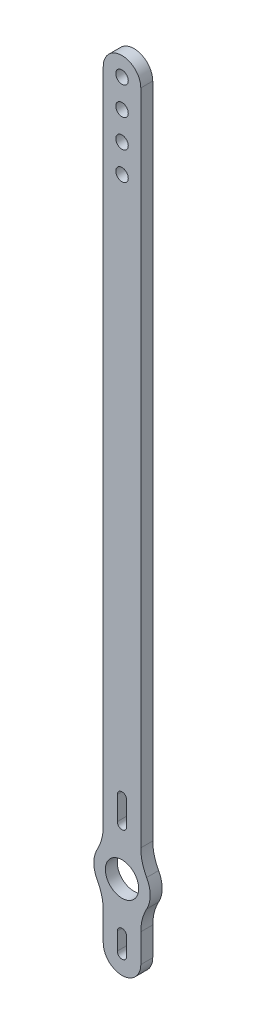
ISO-10303-21;
HEADER;
FILE_DESCRIPTION(('STEP AP214'),'2;1');
FILE_NAME('part.step','',(''),(''),'','','');
FILE_SCHEMA(('AUTOMOTIVE_DESIGN { 1 0 10303 214 1 1 1 1 }'));
ENDSEC;
DATA;
#1=APPLICATION_CONTEXT('core data for automotive mechanical design processes');
#2=APPLICATION_PROTOCOL_DEFINITION('international standard','automotive_design',2000,#1);
#3=PRODUCT_CONTEXT('',#1,'mechanical');
#4=PRODUCT('Part','Part','',(#3));
#5=PRODUCT_RELATED_PRODUCT_CATEGORY('part','',(#4));
#6=PRODUCT_DEFINITION_FORMATION('','',#4);
#7=PRODUCT_DEFINITION_CONTEXT('part definition',#1,'design');
#8=PRODUCT_DEFINITION('design','',#6,#7);
#9=PRODUCT_DEFINITION_SHAPE('','',#8);
#10=(LENGTH_UNIT() NAMED_UNIT(*) SI_UNIT(.MILLI.,.METRE.));
#11=(NAMED_UNIT(*) PLANE_ANGLE_UNIT() SI_UNIT($,.RADIAN.));
#12=(NAMED_UNIT(*) SI_UNIT($,.STERADIAN.) SOLID_ANGLE_UNIT());
#13=UNCERTAINTY_MEASURE_WITH_UNIT(LENGTH_MEASURE(1.E-05),#10,'distance_accuracy_value','');
#14=(GEOMETRIC_REPRESENTATION_CONTEXT(3) GLOBAL_UNCERTAINTY_ASSIGNED_CONTEXT((#13)) GLOBAL_UNIT_ASSIGNED_CONTEXT((#10,
#11,#12)) REPRESENTATION_CONTEXT('',''));
#15=CARTESIAN_POINT('',(0.,0.,0.));
#16=DIRECTION('',(0.,0.,1.));
#17=DIRECTION('',(1.,0.,0.));
#18=AXIS2_PLACEMENT_3D('',#15,#16,#17);
#19=CARTESIAN_POINT('',(0.,148.,2.55));
#20=DIRECTION('',(0.,0.,1.));
#21=DIRECTION('',(1.,0.,0.));
#22=AXIS2_PLACEMENT_3D('',#19,#20,#21);
#23=PLANE('',#22);
#24=CARTESIAN_POINT('',(0.,136.,2.55));
#25=DIRECTION('',(0.,0.,1.));
#26=DIRECTION('',(1.,0.,0.));
#27=AXIS2_PLACEMENT_3D('',#24,#25,#26);
#28=CIRCLE('',#27,1.32999999999999);
#29=CARTESIAN_POINT('',(1.32999999999997,136.,2.55));
#30=VERTEX_POINT('',#29);
#31=EDGE_CURVE('E640',#30,#30,#28,.T.);
#32=ORIENTED_EDGE('',*,*,#31,.F.);
#33=EDGE_LOOP('',(#32));
#34=FACE_BOUND('',#33,.T.);
#35=CARTESIAN_POINT('',(0.,148.,2.55));
#36=DIRECTION('',(0.,0.,1.));
#37=DIRECTION('',(1.,0.,0.));
#38=AXIS2_PLACEMENT_3D('',#35,#36,#37);
#39=CIRCLE('',#38,1.32999999999998);
#40=CARTESIAN_POINT('',(1.32999999999996,148.,2.55));
#41=VERTEX_POINT('',#40);
#42=EDGE_CURVE('E201',#41,#41,#39,.T.);
#43=ORIENTED_EDGE('',*,*,#42,.F.);
#44=EDGE_LOOP('',(#43));
#45=FACE_BOUND('',#44,.T.);
#46=DIRECTION('',(0.,-1.,0.));
#47=VECTOR('',#46,1.);
#48=CARTESIAN_POINT('',(-0.999999999999999,-10.1,2.55));
#49=LINE('',#48,#47);
#50=CARTESIAN_POINT('',(-0.999999999999999,-10.1,2.55));
#51=VERTEX_POINT('',#50);
#52=CARTESIAN_POINT('',(-0.999999999999998,-13.8,2.55));
#53=VERTEX_POINT('',#52);
#54=EDGE_CURVE('E213',#51,#53,#49,.T.);
#55=ORIENTED_EDGE('',*,*,#54,.F.);
#56=CARTESIAN_POINT('',(0.,-10.1,2.55));
#57=DIRECTION('',(0.,0.,1.));
#58=DIRECTION('',(1.,0.,0.));
#59=AXIS2_PLACEMENT_3D('',#56,#57,#58);
#60=CIRCLE('',#59,1.);
#61=CARTESIAN_POINT('',(1.,-10.1,2.55));
#62=VERTEX_POINT('',#61);
#63=EDGE_CURVE('E211',#62,#51,#60,.T.);
#64=ORIENTED_EDGE('',*,*,#63,.F.);
#65=DIRECTION('',(0.,1.,0.));
#66=VECTOR('',#65,1.);
#67=CARTESIAN_POINT('',(1.,-10.1,2.55));
#68=LINE('',#67,#66);
#69=CARTESIAN_POINT('',(1.,-13.8,2.55));
#70=VERTEX_POINT('',#69);
#71=EDGE_CURVE('E219',#70,#62,#68,.T.);
#72=ORIENTED_EDGE('',*,*,#71,.F.);
#73=CARTESIAN_POINT('',(0.,-13.8,2.55));
#74=DIRECTION('',(0.,0.,1.));
#75=DIRECTION('',(1.,0.,0.));
#76=AXIS2_PLACEMENT_3D('',#73,#74,#75);
#77=CIRCLE('',#76,1.);
#78=EDGE_CURVE('E216',#53,#70,#77,.T.);
#79=ORIENTED_EDGE('',*,*,#78,.F.);
#80=EDGE_LOOP('',(#55,#64,#72,#79));
#81=FACE_BOUND('',#80,.T.);
#82=CARTESIAN_POINT('',(0.,148.,2.55));
#83=DIRECTION('',(0.,0.,1.));
#84=DIRECTION('',(1.,0.,0.));
#85=AXIS2_PLACEMENT_3D('',#82,#83,#84);
#86=CIRCLE('',#85,4.);
#87=CARTESIAN_POINT('',(3.99999999999998,148.,2.55));
#88=VERTEX_POINT('',#87);
#89=CARTESIAN_POINT('',(-4.00000000000002,148.,2.55));
#90=VERTEX_POINT('',#89);
#91=EDGE_CURVE('E248',#88,#90,#86,.T.);
#92=ORIENTED_EDGE('',*,*,#91,.T.);
#93=DIRECTION('',(0.,-1.,0.));
#94=VECTOR('',#93,1.);
#95=CARTESIAN_POINT('',(-4.00000000000002,148.,2.55));
#96=LINE('',#95,#94);
#97=CARTESIAN_POINT('',(-4.,7.74596669241483,2.55));
#98=VERTEX_POINT('',#97);
#99=EDGE_CURVE('E251',#90,#98,#96,.T.);
#100=ORIENTED_EDGE('',*,*,#99,.T.);
#101=CARTESIAN_POINT('',(-14.,7.74596669241484,2.55));
#102=DIRECTION('',(0.,0.,-1.));
#103=DIRECTION('',(1.,0.,0.));
#104=AXIS2_PLACEMENT_3D('',#101,#102,#103);
#105=CIRCLE('',#104,10.);
#106=CARTESIAN_POINT('',(-5.25,2.90473750965556,2.55));
#107=VERTEX_POINT('',#106);
#108=EDGE_CURVE('E254',#98,#107,#105,.T.);
#109=ORIENTED_EDGE('',*,*,#108,.T.);
#110=CARTESIAN_POINT('',(0.,0.,2.55));
#111=DIRECTION('',(0.,0.,1.));
#112=DIRECTION('',(1.,0.,0.));
#113=AXIS2_PLACEMENT_3D('',#110,#111,#112);
#114=CIRCLE('',#113,6.);
#115=CARTESIAN_POINT('',(-5.25,-2.90473750965556,2.55));
#116=VERTEX_POINT('',#115);
#117=EDGE_CURVE('E256',#107,#116,#114,.T.);
#118=ORIENTED_EDGE('',*,*,#117,.T.);
#119=CARTESIAN_POINT('',(-14.,-7.74596669241484,2.55));
#120=DIRECTION('',(0.,0.,-1.));
#121=DIRECTION('',(-1.,0.,0.));
#122=AXIS2_PLACEMENT_3D('',#119,#120,#121);
#123=CIRCLE('',#122,10.);
#124=CARTESIAN_POINT('',(-4.,-7.74596669241483,2.55));
#125=VERTEX_POINT('',#124);
#126=EDGE_CURVE('E258',#116,#125,#123,.T.);
#127=ORIENTED_EDGE('',*,*,#126,.T.);
#128=DIRECTION('',(0.,-1.,0.));
#129=VECTOR('',#128,1.);
#130=CARTESIAN_POINT('',(-4.,-7.74596669241483,2.55));
#131=LINE('',#130,#129);
#132=CARTESIAN_POINT('',(-4.,-13.8,2.55));
#133=VERTEX_POINT('',#132);
#134=EDGE_CURVE('E260',#125,#133,#131,.T.);
#135=ORIENTED_EDGE('',*,*,#134,.T.);
#136=CARTESIAN_POINT('',(0.,-13.8,2.55));
#137=DIRECTION('',(0.,0.,1.));
#138=DIRECTION('',(1.,0.,0.));
#139=AXIS2_PLACEMENT_3D('',#136,#137,#138);
#140=CIRCLE('',#139,4.);
#141=CARTESIAN_POINT('',(4.,-13.8,2.55));
#142=VERTEX_POINT('',#141);
#143=EDGE_CURVE('E262',#133,#142,#140,.T.);
#144=ORIENTED_EDGE('',*,*,#143,.T.);
#145=DIRECTION('',(0.,1.,0.));
#146=VECTOR('',#145,1.);
#147=CARTESIAN_POINT('',(4.,-7.74596669241483,2.55));
#148=LINE('',#147,#146);
#149=CARTESIAN_POINT('',(4.,-7.74596669241483,2.55));
#150=VERTEX_POINT('',#149);
#151=EDGE_CURVE('E264',#142,#150,#148,.T.);
#152=ORIENTED_EDGE('',*,*,#151,.T.);
#153=CARTESIAN_POINT('',(14.,-7.74596669241483,2.55));
#154=DIRECTION('',(0.,0.,-1.));
#155=DIRECTION('',(1.,0.,0.));
#156=AXIS2_PLACEMENT_3D('',#153,#154,#155);
#157=CIRCLE('',#156,10.);
#158=CARTESIAN_POINT('',(5.25,-2.90473750965556,2.55));
#159=VERTEX_POINT('',#158);
#160=EDGE_CURVE('E266',#150,#159,#157,.T.);
#161=ORIENTED_EDGE('',*,*,#160,.T.);
#162=CARTESIAN_POINT('',(0.,0.,2.55));
#163=DIRECTION('',(0.,0.,1.));
#164=DIRECTION('',(1.,0.,0.));
#165=AXIS2_PLACEMENT_3D('',#162,#163,#164);
#166=CIRCLE('',#165,6.);
#167=CARTESIAN_POINT('',(5.25,2.90473750965556,2.55));
#168=VERTEX_POINT('',#167);
#169=EDGE_CURVE('E268',#159,#168,#166,.T.);
#170=ORIENTED_EDGE('',*,*,#169,.T.);
#171=CARTESIAN_POINT('',(14.,7.74596669241483,2.55));
#172=DIRECTION('',(0.,0.,-1.));
#173=DIRECTION('',(1.,0.,0.));
#174=AXIS2_PLACEMENT_3D('',#171,#172,#173);
#175=CIRCLE('',#174,10.);
#176=CARTESIAN_POINT('',(4.,7.74596669241483,2.55));
#177=VERTEX_POINT('',#176);
#178=EDGE_CURVE('E270',#168,#177,#175,.T.);
#179=ORIENTED_EDGE('',*,*,#178,.T.);
#180=DIRECTION('',(0.,1.,0.));
#181=VECTOR('',#180,1.);
#182=CARTESIAN_POINT('',(3.99999999999998,148.,2.55));
#183=LINE('',#182,#181);
#184=EDGE_CURVE('E272',#177,#88,#183,.T.);
#185=ORIENTED_EDGE('',*,*,#184,.T.);
#186=EDGE_LOOP('',(#92,#100,#109,#118,#127,#135,#144,#152,#161,#170,#179,#185));
#187=FACE_BOUND('',#186,.T.);
#188=CARTESIAN_POINT('',(0.,0.,2.55));
#189=DIRECTION('',(0.,0.,1.));
#190=DIRECTION('',(1.,0.,0.));
#191=AXIS2_PLACEMENT_3D('',#188,#189,#190);
#192=CIRCLE('',#191,3.55);
#193=CARTESIAN_POINT('',(3.55,0.,2.55));
#194=VERTEX_POINT('',#193);
#195=EDGE_CURVE('E242',#194,#194,#192,.T.);
#196=ORIENTED_EDGE('',*,*,#195,.F.);
#197=EDGE_LOOP('',(#196));
#198=FACE_BOUND('',#197,.T.);
#199=DIRECTION('',(0.,-1.,0.));
#200=VECTOR('',#199,1.);
#201=CARTESIAN_POINT('',(-1.,15.1,2.55));
#202=LINE('',#201,#200);
#203=CARTESIAN_POINT('',(-1.,15.1,2.55));
#204=VERTEX_POINT('',#203);
#205=CARTESIAN_POINT('',(-1.,10.1,2.55));
#206=VERTEX_POINT('',#205);
#207=EDGE_CURVE('E180',#204,#206,#202,.T.);
#208=ORIENTED_EDGE('',*,*,#207,.F.);
#209=CARTESIAN_POINT('',(0.,15.1,2.55));
#210=DIRECTION('',(0.,0.,1.));
#211=DIRECTION('',(1.,0.,0.));
#212=AXIS2_PLACEMENT_3D('',#209,#210,#211);
#213=CIRCLE('',#212,1.);
#214=CARTESIAN_POINT('',(0.999999999999998,15.1,2.55));
#215=VERTEX_POINT('',#214);
#216=EDGE_CURVE('E172',#215,#204,#213,.T.);
#217=ORIENTED_EDGE('',*,*,#216,.F.);
#218=DIRECTION('',(0.,1.,0.));
#219=VECTOR('',#218,1.);
#220=CARTESIAN_POINT('',(0.999999999999998,15.1,2.55));
#221=LINE('',#220,#219);
#222=CARTESIAN_POINT('',(0.999999999999999,10.1,2.55));
#223=VERTEX_POINT('',#222);
#224=EDGE_CURVE('E195',#223,#215,#221,.T.);
#225=ORIENTED_EDGE('',*,*,#224,.F.);
#226=CARTESIAN_POINT('',(0.,10.1,2.55));
#227=DIRECTION('',(0.,0.,1.));
#228=DIRECTION('',(1.,0.,0.));
#229=AXIS2_PLACEMENT_3D('',#226,#227,#228);
#230=CIRCLE('',#229,1.);
#231=EDGE_CURVE('E193',#206,#223,#230,.T.);
#232=ORIENTED_EDGE('',*,*,#231,.F.);
#233=EDGE_LOOP('',(#208,#217,#225,#232));
#234=FACE_BOUND('',#233,.T.);
#235=CARTESIAN_POINT('',(0.,142.,2.55));
#236=DIRECTION('',(0.,0.,1.));
#237=DIRECTION('',(1.,0.,0.));
#238=AXIS2_PLACEMENT_3D('',#235,#236,#237);
#239=CIRCLE('',#238,1.32999999999999);
#240=CARTESIAN_POINT('',(1.32999999999997,142.,2.55));
#241=VERTEX_POINT('',#240);
#242=EDGE_CURVE('E646',#241,#241,#239,.T.);
#243=ORIENTED_EDGE('',*,*,#242,.F.);
#244=EDGE_LOOP('',(#243));
#245=FACE_BOUND('',#244,.T.);
#246=CARTESIAN_POINT('',(0.,130.,2.55));
#247=DIRECTION('',(0.,0.,1.));
#248=DIRECTION('',(1.,0.,0.));
#249=AXIS2_PLACEMENT_3D('',#246,#247,#248);
#250=CIRCLE('',#249,1.33);
#251=CARTESIAN_POINT('',(1.32999999999998,130.,2.55));
#252=VERTEX_POINT('',#251);
#253=EDGE_CURVE('E631',#252,#252,#250,.T.);
#254=ORIENTED_EDGE('',*,*,#253,.F.);
#255=EDGE_LOOP('',(#254));
#256=FACE_BOUND('',#255,.T.);
#257=ADVANCED_FACE('F35',(#34,#45,#81,#187,#198,#234,#245,#256),#23,.T.);
#258=CARTESIAN_POINT('',(0.,148.,0.));
#259=DIRECTION('',(0.,0.,1.));
#260=DIRECTION('',(1.,0.,0.));
#261=AXIS2_PLACEMENT_3D('',#258,#259,#260);
#262=PLANE('',#261);
#263=CARTESIAN_POINT('',(0.,136.,0.));
#264=DIRECTION('',(0.,0.,1.));
#265=DIRECTION('',(1.,0.,0.));
#266=AXIS2_PLACEMENT_3D('',#263,#264,#265);
#267=CIRCLE('',#266,1.32999999999999);
#268=CARTESIAN_POINT('',(1.32999999999997,136.,0.));
#269=VERTEX_POINT('',#268);
#270=EDGE_CURVE('E637',#269,#269,#267,.T.);
#271=ORIENTED_EDGE('',*,*,#270,.T.);
#272=EDGE_LOOP('',(#271));
#273=FACE_BOUND('',#272,.T.);
#274=CARTESIAN_POINT('',(0.,148.,0.));
#275=DIRECTION('',(0.,0.,1.));
#276=DIRECTION('',(1.,0.,0.));
#277=AXIS2_PLACEMENT_3D('',#274,#275,#276);
#278=CIRCLE('',#277,1.32999999999998);
#279=CARTESIAN_POINT('',(1.32999999999996,148.,0.));
#280=VERTEX_POINT('',#279);
#281=EDGE_CURVE('E649',#280,#280,#278,.T.);
#282=ORIENTED_EDGE('',*,*,#281,.T.);
#283=EDGE_LOOP('',(#282));
#284=FACE_BOUND('',#283,.T.);
#285=CARTESIAN_POINT('',(0.,-10.1,0.));
#286=DIRECTION('',(0.,0.,1.));
#287=DIRECTION('',(1.,0.,0.));
#288=AXIS2_PLACEMENT_3D('',#285,#286,#287);
#289=CIRCLE('',#288,1.);
#290=CARTESIAN_POINT('',(1.,-10.1,0.));
#291=VERTEX_POINT('',#290);
#292=CARTESIAN_POINT('',(-0.999999999999999,-10.1,0.));
#293=VERTEX_POINT('',#292);
#294=EDGE_CURVE('E188',#291,#293,#289,.T.);
#295=ORIENTED_EDGE('',*,*,#294,.T.);
#296=DIRECTION('',(0.,-1.,0.));
#297=VECTOR('',#296,1.);
#298=CARTESIAN_POINT('',(-0.999999999999999,-10.1,0.));
#299=LINE('',#298,#297);
#300=CARTESIAN_POINT('',(-0.999999999999998,-13.8,0.));
#301=VERTEX_POINT('',#300);
#302=EDGE_CURVE('E224',#293,#301,#299,.T.);
#303=ORIENTED_EDGE('',*,*,#302,.T.);
#304=CARTESIAN_POINT('',(0.,-13.8,0.));
#305=DIRECTION('',(0.,0.,1.));
#306=DIRECTION('',(1.,0.,0.));
#307=AXIS2_PLACEMENT_3D('',#304,#305,#306);
#308=CIRCLE('',#307,1.);
#309=CARTESIAN_POINT('',(1.,-13.8,0.));
#310=VERTEX_POINT('',#309);
#311=EDGE_CURVE('E227',#301,#310,#308,.T.);
#312=ORIENTED_EDGE('',*,*,#311,.T.);
#313=DIRECTION('',(0.,1.,0.));
#314=VECTOR('',#313,1.);
#315=CARTESIAN_POINT('',(1.,-10.1,0.));
#316=LINE('',#315,#314);
#317=EDGE_CURVE('E214',#310,#291,#316,.T.);
#318=ORIENTED_EDGE('',*,*,#317,.T.);
#319=EDGE_LOOP('',(#295,#303,#312,#318));
#320=FACE_BOUND('',#319,.T.);
#321=CARTESIAN_POINT('',(0.,148.,0.));
#322=DIRECTION('',(0.,0.,1.));
#323=DIRECTION('',(1.,0.,0.));
#324=AXIS2_PLACEMENT_3D('',#321,#322,#323);
#325=CIRCLE('',#324,4.);
#326=CARTESIAN_POINT('',(3.99999999999998,148.,0.));
#327=VERTEX_POINT('',#326);
#328=CARTESIAN_POINT('',(-4.00000000000002,148.,0.));
#329=VERTEX_POINT('',#328);
#330=EDGE_CURVE('E245',#327,#329,#325,.T.);
#331=ORIENTED_EDGE('',*,*,#330,.F.);
#332=DIRECTION('',(0.,1.,0.));
#333=VECTOR('',#332,1.);
#334=CARTESIAN_POINT('',(3.99999999999998,148.,0.));
#335=LINE('',#334,#333);
#336=CARTESIAN_POINT('',(4.,7.74596669241483,0.));
#337=VERTEX_POINT('',#336);
#338=EDGE_CURVE('E252',#337,#327,#335,.T.);
#339=ORIENTED_EDGE('',*,*,#338,.F.);
#340=CARTESIAN_POINT('',(14.,7.74596669241483,0.));
#341=DIRECTION('',(0.,0.,-1.));
#342=DIRECTION('',(1.,0.,0.));
#343=AXIS2_PLACEMENT_3D('',#340,#341,#342);
#344=CIRCLE('',#343,10.);
#345=CARTESIAN_POINT('',(5.25,2.90473750965556,0.));
#346=VERTEX_POINT('',#345);
#347=EDGE_CURVE('E295',#346,#337,#344,.T.);
#348=ORIENTED_EDGE('',*,*,#347,.F.);
#349=CARTESIAN_POINT('',(0.,0.,0.));
#350=DIRECTION('',(0.,0.,1.));
#351=DIRECTION('',(1.,0.,0.));
#352=AXIS2_PLACEMENT_3D('',#349,#350,#351);
#353=CIRCLE('',#352,6.);
#354=CARTESIAN_POINT('',(5.25,-2.90473750965556,0.));
#355=VERTEX_POINT('',#354);
#356=EDGE_CURVE('E293',#355,#346,#353,.T.);
#357=ORIENTED_EDGE('',*,*,#356,.F.);
#358=CARTESIAN_POINT('',(14.,-7.74596669241483,0.));
#359=DIRECTION('',(0.,0.,-1.));
#360=DIRECTION('',(1.,0.,0.));
#361=AXIS2_PLACEMENT_3D('',#358,#359,#360);
#362=CIRCLE('',#361,10.);
#363=CARTESIAN_POINT('',(4.,-7.74596669241483,0.));
#364=VERTEX_POINT('',#363);
#365=EDGE_CURVE('E291',#364,#355,#362,.T.);
#366=ORIENTED_EDGE('',*,*,#365,.F.);
#367=DIRECTION('',(0.,1.,0.));
#368=VECTOR('',#367,1.);
#369=CARTESIAN_POINT('',(4.,-7.74596669241483,0.));
#370=LINE('',#369,#368);
#371=CARTESIAN_POINT('',(4.,-13.8,0.));
#372=VERTEX_POINT('',#371);
#373=EDGE_CURVE('E289',#372,#364,#370,.T.);
#374=ORIENTED_EDGE('',*,*,#373,.F.);
#375=CARTESIAN_POINT('',(0.,-13.8,0.));
#376=DIRECTION('',(0.,0.,1.));
#377=DIRECTION('',(1.,0.,0.));
#378=AXIS2_PLACEMENT_3D('',#375,#376,#377);
#379=CIRCLE('',#378,4.);
#380=CARTESIAN_POINT('',(-4.,-13.8,0.));
#381=VERTEX_POINT('',#380);
#382=EDGE_CURVE('E287',#381,#372,#379,.T.);
#383=ORIENTED_EDGE('',*,*,#382,.F.);
#384=DIRECTION('',(0.,-1.,0.));
#385=VECTOR('',#384,1.);
#386=CARTESIAN_POINT('',(-4.,-7.74596669241483,0.));
#387=LINE('',#386,#385);
#388=CARTESIAN_POINT('',(-4.,-7.74596669241483,0.));
#389=VERTEX_POINT('',#388);
#390=EDGE_CURVE('E285',#389,#381,#387,.T.);
#391=ORIENTED_EDGE('',*,*,#390,.F.);
#392=CARTESIAN_POINT('',(-14.,-7.74596669241484,0.));
#393=DIRECTION('',(0.,0.,-1.));
#394=DIRECTION('',(-1.,0.,0.));
#395=AXIS2_PLACEMENT_3D('',#392,#393,#394);
#396=CIRCLE('',#395,10.);
#397=CARTESIAN_POINT('',(-5.25,-2.90473750965556,0.));
#398=VERTEX_POINT('',#397);
#399=EDGE_CURVE('E283',#398,#389,#396,.T.);
#400=ORIENTED_EDGE('',*,*,#399,.F.);
#401=CARTESIAN_POINT('',(0.,0.,0.));
#402=DIRECTION('',(0.,0.,1.));
#403=DIRECTION('',(1.,0.,0.));
#404=AXIS2_PLACEMENT_3D('',#401,#402,#403);
#405=CIRCLE('',#404,6.);
#406=CARTESIAN_POINT('',(-5.25,2.90473750965556,0.));
#407=VERTEX_POINT('',#406);
#408=EDGE_CURVE('E281',#407,#398,#405,.T.);
#409=ORIENTED_EDGE('',*,*,#408,.F.);
#410=CARTESIAN_POINT('',(-14.,7.74596669241484,0.));
#411=DIRECTION('',(0.,0.,-1.));
#412=DIRECTION('',(1.,0.,0.));
#413=AXIS2_PLACEMENT_3D('',#410,#411,#412);
#414=CIRCLE('',#413,10.);
#415=CARTESIAN_POINT('',(-4.,7.74596669241483,0.));
#416=VERTEX_POINT('',#415);
#417=EDGE_CURVE('E279',#416,#407,#414,.T.);
#418=ORIENTED_EDGE('',*,*,#417,.F.);
#419=DIRECTION('',(0.,-1.,0.));
#420=VECTOR('',#419,1.);
#421=CARTESIAN_POINT('',(-4.00000000000002,148.,0.));
#422=LINE('',#421,#420);
#423=EDGE_CURVE('E277',#329,#416,#422,.T.);
#424=ORIENTED_EDGE('',*,*,#423,.F.);
#425=EDGE_LOOP('',(#331,#339,#348,#357,#366,#374,#383,#391,#400,#409,#418,#424));
#426=FACE_BOUND('',#425,.T.);
#427=CARTESIAN_POINT('',(0.,0.,0.));
#428=DIRECTION('',(0.,0.,1.));
#429=DIRECTION('',(1.,0.,0.));
#430=AXIS2_PLACEMENT_3D('',#427,#428,#429);
#431=CIRCLE('',#430,3.55);
#432=CARTESIAN_POINT('',(3.55,0.,0.));
#433=VERTEX_POINT('',#432);
#434=EDGE_CURVE('E241',#433,#433,#431,.T.);
#435=ORIENTED_EDGE('',*,*,#434,.T.);
#436=EDGE_LOOP('',(#435));
#437=FACE_BOUND('',#436,.T.);
#438=CARTESIAN_POINT('',(0.,15.1,0.));
#439=DIRECTION('',(0.,0.,1.));
#440=DIRECTION('',(1.,0.,0.));
#441=AXIS2_PLACEMENT_3D('',#438,#439,#440);
#442=CIRCLE('',#441,1.);
#443=CARTESIAN_POINT('',(0.999999999999998,15.1,0.));
#444=VERTEX_POINT('',#443);
#445=CARTESIAN_POINT('',(-1.,15.1,0.));
#446=VERTEX_POINT('',#445);
#447=EDGE_CURVE('E58',#444,#446,#442,.T.);
#448=ORIENTED_EDGE('',*,*,#447,.T.);
#449=DIRECTION('',(0.,-1.,0.));
#450=VECTOR('',#449,1.);
#451=CARTESIAN_POINT('',(-1.,15.1,0.));
#452=LINE('',#451,#450);
#453=CARTESIAN_POINT('',(-1.,10.1,0.));
#454=VERTEX_POINT('',#453);
#455=EDGE_CURVE('E187',#446,#454,#452,.T.);
#456=ORIENTED_EDGE('',*,*,#455,.T.);
#457=CARTESIAN_POINT('',(0.,10.1,0.));
#458=DIRECTION('',(0.,0.,1.));
#459=DIRECTION('',(1.,0.,0.));
#460=AXIS2_PLACEMENT_3D('',#457,#458,#459);
#461=CIRCLE('',#460,1.);
#462=CARTESIAN_POINT('',(1.,10.1,0.));
#463=VERTEX_POINT('',#462);
#464=EDGE_CURVE('E203',#454,#463,#461,.T.);
#465=ORIENTED_EDGE('',*,*,#464,.T.);
#466=DIRECTION('',(0.,1.,0.));
#467=VECTOR('',#466,1.);
#468=CARTESIAN_POINT('',(0.999999999999998,15.1,0.));
#469=LINE('',#468,#467);
#470=EDGE_CURVE('E181',#463,#444,#469,.T.);
#471=ORIENTED_EDGE('',*,*,#470,.T.);
#472=EDGE_LOOP('',(#448,#456,#465,#471));
#473=FACE_BOUND('',#472,.T.);
#474=CARTESIAN_POINT('',(0.,142.,0.));
#475=DIRECTION('',(0.,0.,1.));
#476=DIRECTION('',(1.,0.,0.));
#477=AXIS2_PLACEMENT_3D('',#474,#475,#476);
#478=CIRCLE('',#477,1.32999999999999);
#479=CARTESIAN_POINT('',(1.32999999999997,142.,0.));
#480=VERTEX_POINT('',#479);
#481=EDGE_CURVE('E643',#480,#480,#478,.T.);
#482=ORIENTED_EDGE('',*,*,#481,.T.);
#483=EDGE_LOOP('',(#482));
#484=FACE_BOUND('',#483,.T.);
#485=CARTESIAN_POINT('',(0.,130.,0.));
#486=DIRECTION('',(0.,0.,1.));
#487=DIRECTION('',(1.,0.,0.));
#488=AXIS2_PLACEMENT_3D('',#485,#486,#487);
#489=CIRCLE('',#488,1.33);
#490=CARTESIAN_POINT('',(1.32999999999998,130.,0.));
#491=VERTEX_POINT('',#490);
#492=EDGE_CURVE('E634',#491,#491,#489,.T.);
#493=ORIENTED_EDGE('',*,*,#492,.T.);
#494=EDGE_LOOP('',(#493));
#495=FACE_BOUND('',#494,.T.);
#496=ADVANCED_FACE('F337',(#273,#284,#320,#426,#437,#473,#484,#495),#262,.F.);
#497=CARTESIAN_POINT('',(0.,148.,2.55));
#498=DIRECTION('',(0.,0.,-1.));
#499=DIRECTION('',(-1.,0.,0.));
#500=AXIS2_PLACEMENT_3D('',#497,#498,#499);
#501=CYLINDRICAL_SURFACE('',#500,4.);
#502=ORIENTED_EDGE('',*,*,#330,.T.);
#503=DIRECTION('',(0.,0.,-1.));
#504=VECTOR('',#503,1.);
#505=CARTESIAN_POINT('',(-4.00000000000002,148.,2.55));
#506=LINE('',#505,#504);
#507=EDGE_CURVE('E11',#90,#329,#506,.T.);
#508=ORIENTED_EDGE('',*,*,#507,.F.);
#509=ORIENTED_EDGE('',*,*,#91,.F.);
#510=DIRECTION('',(0.,0.,-1.));
#511=VECTOR('',#510,1.);
#512=CARTESIAN_POINT('',(3.99999999999998,148.,2.55));
#513=LINE('',#512,#511);
#514=EDGE_CURVE('E274',#88,#327,#513,.T.);
#515=ORIENTED_EDGE('',*,*,#514,.T.);
#516=EDGE_LOOP('',(#502,#508,#509,#515));
#517=FACE_BOUND('',#516,.T.);
#518=ADVANCED_FACE('F37',(#517),#501,.T.);
#519=CARTESIAN_POINT('',(-4.00000000000002,148.,2.55));
#520=DIRECTION('',(1.,0.,0.));
#521=DIRECTION('',(0.,1.,0.));
#522=AXIS2_PLACEMENT_3D('',#519,#520,#521);
#523=PLANE('',#522);
#524=ORIENTED_EDGE('',*,*,#423,.T.);
#525=DIRECTION('',(0.,0.,-1.));
#526=VECTOR('',#525,1.);
#527=CARTESIAN_POINT('',(-4.,7.74596669241483,2.55));
#528=LINE('',#527,#526);
#529=EDGE_CURVE('E43',#98,#416,#528,.T.);
#530=ORIENTED_EDGE('',*,*,#529,.F.);
#531=ORIENTED_EDGE('',*,*,#99,.F.);
#532=ORIENTED_EDGE('',*,*,#507,.T.);
#533=EDGE_LOOP('',(#524,#530,#531,#532));
#534=FACE_BOUND('',#533,.T.);
#535=ADVANCED_FACE('F355',(#534),#523,.F.);
#536=CARTESIAN_POINT('',(-14.,7.74596669241484,2.55));
#537=DIRECTION('',(0.,0.,-1.));
#538=DIRECTION('',(-1.,0.,0.));
#539=AXIS2_PLACEMENT_3D('',#536,#537,#538);
#540=CYLINDRICAL_SURFACE('',#539,10.);
#541=ORIENTED_EDGE('',*,*,#417,.T.);
#542=DIRECTION('',(0.,0.,-1.));
#543=VECTOR('',#542,1.);
#544=CARTESIAN_POINT('',(-5.25,2.90473750965556,2.55));
#545=LINE('',#544,#543);
#546=EDGE_CURVE('E324',#107,#407,#545,.T.);
#547=ORIENTED_EDGE('',*,*,#546,.F.);
#548=ORIENTED_EDGE('',*,*,#108,.F.);
#549=ORIENTED_EDGE('',*,*,#529,.T.);
#550=EDGE_LOOP('',(#541,#547,#548,#549));
#551=FACE_BOUND('',#550,.T.);
#552=ADVANCED_FACE('F331',(#551),#540,.F.);
#553=CARTESIAN_POINT('',(0.,0.,2.55));
#554=DIRECTION('',(0.,0.,-1.));
#555=DIRECTION('',(-1.,0.,0.));
#556=AXIS2_PLACEMENT_3D('',#553,#554,#555);
#557=CYLINDRICAL_SURFACE('',#556,6.);
#558=ORIENTED_EDGE('',*,*,#408,.T.);
#559=DIRECTION('',(0.,0.,-1.));
#560=VECTOR('',#559,1.);
#561=CARTESIAN_POINT('',(-5.25,-2.90473750965556,2.55));
#562=LINE('',#561,#560);
#563=EDGE_CURVE('E321',#116,#398,#562,.T.);
#564=ORIENTED_EDGE('',*,*,#563,.F.);
#565=ORIENTED_EDGE('',*,*,#117,.F.);
#566=ORIENTED_EDGE('',*,*,#546,.T.);
#567=EDGE_LOOP('',(#558,#564,#565,#566));
#568=FACE_BOUND('',#567,.T.);
#569=ADVANCED_FACE('F343',(#568),#557,.T.);
#570=CARTESIAN_POINT('',(-14.,-7.74596669241484,2.55));
#571=DIRECTION('',(0.,0.,-1.));
#572=DIRECTION('',(-1.,0.,0.));
#573=AXIS2_PLACEMENT_3D('',#570,#571,#572);
#574=CYLINDRICAL_SURFACE('',#573,10.);
#575=ORIENTED_EDGE('',*,*,#399,.T.);
#576=DIRECTION('',(0.,0.,-1.));
#577=VECTOR('',#576,1.);
#578=CARTESIAN_POINT('',(-4.,-7.74596669241483,2.55));
#579=LINE('',#578,#577);
#580=EDGE_CURVE('E318',#125,#389,#579,.T.);
#581=ORIENTED_EDGE('',*,*,#580,.F.);
#582=ORIENTED_EDGE('',*,*,#126,.F.);
#583=ORIENTED_EDGE('',*,*,#563,.T.);
#584=EDGE_LOOP('',(#575,#581,#582,#583));
#585=FACE_BOUND('',#584,.T.);
#586=ADVANCED_FACE('F347',(#585),#574,.F.);
#587=CARTESIAN_POINT('',(-4.,-7.74596669241483,2.55));
#588=DIRECTION('',(1.,0.,0.));
#589=DIRECTION('',(0.,0.,-1.));
#590=AXIS2_PLACEMENT_3D('',#587,#588,#589);
#591=PLANE('',#590);
#592=ORIENTED_EDGE('',*,*,#390,.T.);
#593=DIRECTION('',(0.,0.,-1.));
#594=VECTOR('',#593,1.);
#595=CARTESIAN_POINT('',(-4.,-13.8,2.55));
#596=LINE('',#595,#594);
#597=EDGE_CURVE('E315',#133,#381,#596,.T.);
#598=ORIENTED_EDGE('',*,*,#597,.F.);
#599=ORIENTED_EDGE('',*,*,#134,.F.);
#600=ORIENTED_EDGE('',*,*,#580,.T.);
#601=EDGE_LOOP('',(#592,#598,#599,#600));
#602=FACE_BOUND('',#601,.T.);
#603=ADVANCED_FACE('F388',(#602),#591,.F.);
#604=CARTESIAN_POINT('',(0.,-13.8,2.55));
#605=DIRECTION('',(0.,0.,-1.));
#606=DIRECTION('',(-1.,0.,0.));
#607=AXIS2_PLACEMENT_3D('',#604,#605,#606);
#608=CYLINDRICAL_SURFACE('',#607,4.);
#609=ORIENTED_EDGE('',*,*,#382,.T.);
#610=DIRECTION('',(0.,0.,-1.));
#611=VECTOR('',#610,1.);
#612=CARTESIAN_POINT('',(4.,-13.8,2.55));
#613=LINE('',#612,#611);
#614=EDGE_CURVE('E312',#142,#372,#613,.T.);
#615=ORIENTED_EDGE('',*,*,#614,.F.);
#616=ORIENTED_EDGE('',*,*,#143,.F.);
#617=ORIENTED_EDGE('',*,*,#597,.T.);
#618=EDGE_LOOP('',(#609,#615,#616,#617));
#619=FACE_BOUND('',#618,.T.);
#620=ADVANCED_FACE('F386',(#619),#608,.T.);
#621=CARTESIAN_POINT('',(4.,-7.74596669241483,2.55));
#622=DIRECTION('',(-1.,0.,0.));
#623=DIRECTION('',(0.,-1.,0.));
#624=AXIS2_PLACEMENT_3D('',#621,#622,#623);
#625=PLANE('',#624);
#626=ORIENTED_EDGE('',*,*,#373,.T.);
#627=DIRECTION('',(0.,0.,-1.));
#628=VECTOR('',#627,1.);
#629=CARTESIAN_POINT('',(4.,-7.74596669241483,2.55));
#630=LINE('',#629,#628);
#631=EDGE_CURVE('E309',#150,#364,#630,.T.);
#632=ORIENTED_EDGE('',*,*,#631,.F.);
#633=ORIENTED_EDGE('',*,*,#151,.F.);
#634=ORIENTED_EDGE('',*,*,#614,.T.);
#635=EDGE_LOOP('',(#626,#632,#633,#634));
#636=FACE_BOUND('',#635,.T.);
#637=ADVANCED_FACE('F382',(#636),#625,.F.);
#638=CARTESIAN_POINT('',(14.,-7.74596669241483,2.55));
#639=DIRECTION('',(0.,0.,-1.));
#640=DIRECTION('',(-1.,0.,0.));
#641=AXIS2_PLACEMENT_3D('',#638,#639,#640);
#642=CYLINDRICAL_SURFACE('',#641,10.);
#643=ORIENTED_EDGE('',*,*,#365,.T.);
#644=DIRECTION('',(0.,0.,-1.));
#645=VECTOR('',#644,1.);
#646=CARTESIAN_POINT('',(5.25,-2.90473750965556,2.55));
#647=LINE('',#646,#645);
#648=EDGE_CURVE('E306',#159,#355,#647,.T.);
#649=ORIENTED_EDGE('',*,*,#648,.F.);
#650=ORIENTED_EDGE('',*,*,#160,.F.);
#651=ORIENTED_EDGE('',*,*,#631,.T.);
#652=EDGE_LOOP('',(#643,#649,#650,#651));
#653=FACE_BOUND('',#652,.T.);
#654=ADVANCED_FACE('F377',(#653),#642,.F.);
#655=CARTESIAN_POINT('',(0.,0.,2.55));
#656=DIRECTION('',(0.,0.,-1.));
#657=DIRECTION('',(-1.,0.,0.));
#658=AXIS2_PLACEMENT_3D('',#655,#656,#657);
#659=CYLINDRICAL_SURFACE('',#658,6.);
#660=ORIENTED_EDGE('',*,*,#356,.T.);
#661=DIRECTION('',(0.,0.,-1.));
#662=VECTOR('',#661,1.);
#663=CARTESIAN_POINT('',(5.25,2.90473750965556,2.55));
#664=LINE('',#663,#662);
#665=EDGE_CURVE('E303',#168,#346,#664,.T.);
#666=ORIENTED_EDGE('',*,*,#665,.F.);
#667=ORIENTED_EDGE('',*,*,#169,.F.);
#668=ORIENTED_EDGE('',*,*,#648,.T.);
#669=EDGE_LOOP('',(#660,#666,#667,#668));
#670=FACE_BOUND('',#669,.T.);
#671=ADVANCED_FACE('F371',(#670),#659,.T.);
#672=CARTESIAN_POINT('',(14.,7.74596669241483,2.55));
#673=DIRECTION('',(0.,0.,-1.));
#674=DIRECTION('',(-1.,0.,0.));
#675=AXIS2_PLACEMENT_3D('',#672,#673,#674);
#676=CYLINDRICAL_SURFACE('',#675,10.);
#677=ORIENTED_EDGE('',*,*,#347,.T.);
#678=DIRECTION('',(0.,0.,-1.));
#679=VECTOR('',#678,1.);
#680=CARTESIAN_POINT('',(4.,7.74596669241483,2.55));
#681=LINE('',#680,#679);
#682=EDGE_CURVE('E300',#177,#337,#681,.T.);
#683=ORIENTED_EDGE('',*,*,#682,.F.);
#684=ORIENTED_EDGE('',*,*,#178,.F.);
#685=ORIENTED_EDGE('',*,*,#665,.T.);
#686=EDGE_LOOP('',(#677,#683,#684,#685));
#687=FACE_BOUND('',#686,.T.);
#688=ADVANCED_FACE('F367',(#687),#676,.F.);
#689=CARTESIAN_POINT('',(3.99999999999998,148.,2.55));
#690=DIRECTION('',(-1.,0.,0.));
#691=DIRECTION('',(0.,-1.,0.));
#692=AXIS2_PLACEMENT_3D('',#689,#690,#691);
#693=PLANE('',#692);
#694=ORIENTED_EDGE('',*,*,#338,.T.);
#695=ORIENTED_EDGE('',*,*,#514,.F.);
#696=ORIENTED_EDGE('',*,*,#184,.F.);
#697=ORIENTED_EDGE('',*,*,#682,.T.);
#698=EDGE_LOOP('',(#694,#695,#696,#697));
#699=FACE_BOUND('',#698,.T.);
#700=ADVANCED_FACE('F362',(#699),#693,.F.);
#701=CARTESIAN_POINT('',(0.,0.,2.55));
#702=DIRECTION('',(0.,0.,-1.));
#703=DIRECTION('',(-1.,0.,0.));
#704=AXIS2_PLACEMENT_3D('',#701,#702,#703);
#705=CYLINDRICAL_SURFACE('',#704,3.55);
#706=ORIENTED_EDGE('',*,*,#195,.T.);
#707=EDGE_LOOP('',(#706));
#708=FACE_BOUND('',#707,.T.);
#709=ORIENTED_EDGE('',*,*,#434,.F.);
#710=EDGE_LOOP('',(#709));
#711=FACE_BOUND('',#710,.T.);
#712=ADVANCED_FACE('F408',(#708,#711),#705,.F.);
#713=CARTESIAN_POINT('',(0.,-10.1,2.55));
#714=DIRECTION('',(0.,0.,-1.));
#715=DIRECTION('',(-1.,0.,0.));
#716=AXIS2_PLACEMENT_3D('',#713,#714,#715);
#717=CYLINDRICAL_SURFACE('',#716,1.);
#718=ORIENTED_EDGE('',*,*,#294,.F.);
#719=DIRECTION('',(0.,0.,-1.));
#720=VECTOR('',#719,1.);
#721=CARTESIAN_POINT('',(1.,-10.1,2.55));
#722=LINE('',#721,#720);
#723=EDGE_CURVE('E221',#62,#291,#722,.T.);
#724=ORIENTED_EDGE('',*,*,#723,.F.);
#725=ORIENTED_EDGE('',*,*,#63,.T.);
#726=DIRECTION('',(0.,0.,-1.));
#727=VECTOR('',#726,1.);
#728=CARTESIAN_POINT('',(-0.999999999999999,-10.1,2.55));
#729=LINE('',#728,#727);
#730=EDGE_CURVE('E238',#51,#293,#729,.T.);
#731=ORIENTED_EDGE('',*,*,#730,.T.);
#732=EDGE_LOOP('',(#718,#724,#725,#731));
#733=FACE_BOUND('',#732,.T.);
#734=ADVANCED_FACE('F446',(#733),#717,.F.);
#735=CARTESIAN_POINT('',(-0.999999999999999,-10.1,2.55));
#736=DIRECTION('',(1.,0.,0.));
#737=DIRECTION('',(0.,1.,0.));
#738=AXIS2_PLACEMENT_3D('',#735,#736,#737);
#739=PLANE('',#738);
#740=ORIENTED_EDGE('',*,*,#302,.F.);
#741=ORIENTED_EDGE('',*,*,#730,.F.);
#742=ORIENTED_EDGE('',*,*,#54,.T.);
#743=DIRECTION('',(0.,0.,-1.));
#744=VECTOR('',#743,1.);
#745=CARTESIAN_POINT('',(-0.999999999999998,-13.8,2.55));
#746=LINE('',#745,#744);
#747=EDGE_CURVE('E236',#53,#301,#746,.T.);
#748=ORIENTED_EDGE('',*,*,#747,.T.);
#749=EDGE_LOOP('',(#740,#741,#742,#748));
#750=FACE_BOUND('',#749,.T.);
#751=ADVANCED_FACE('F453',(#750),#739,.T.);
#752=CARTESIAN_POINT('',(0.,-13.8,2.55));
#753=DIRECTION('',(0.,0.,-1.));
#754=DIRECTION('',(-1.,0.,0.));
#755=AXIS2_PLACEMENT_3D('',#752,#753,#754);
#756=CYLINDRICAL_SURFACE('',#755,1.);
#757=ORIENTED_EDGE('',*,*,#311,.F.);
#758=ORIENTED_EDGE('',*,*,#747,.F.);
#759=ORIENTED_EDGE('',*,*,#78,.T.);
#760=DIRECTION('',(0.,0.,-1.));
#761=VECTOR('',#760,1.);
#762=CARTESIAN_POINT('',(1.,-13.8,2.55));
#763=LINE('',#762,#761);
#764=EDGE_CURVE('E234',#70,#310,#763,.T.);
#765=ORIENTED_EDGE('',*,*,#764,.T.);
#766=EDGE_LOOP('',(#757,#758,#759,#765));
#767=FACE_BOUND('',#766,.T.);
#768=ADVANCED_FACE('F460',(#767),#756,.F.);
#769=CARTESIAN_POINT('',(1.,-10.1,2.55));
#770=DIRECTION('',(-1.,0.,0.));
#771=DIRECTION('',(0.,0.,1.));
#772=AXIS2_PLACEMENT_3D('',#769,#770,#771);
#773=PLANE('',#772);
#774=ORIENTED_EDGE('',*,*,#317,.F.);
#775=ORIENTED_EDGE('',*,*,#764,.F.);
#776=ORIENTED_EDGE('',*,*,#71,.T.);
#777=ORIENTED_EDGE('',*,*,#723,.T.);
#778=EDGE_LOOP('',(#774,#775,#776,#777));
#779=FACE_BOUND('',#778,.T.);
#780=ADVANCED_FACE('F468',(#779),#773,.T.);
#781=CARTESIAN_POINT('',(0.,15.1,2.55));
#782=DIRECTION('',(0.,0.,-1.));
#783=DIRECTION('',(-1.,0.,0.));
#784=AXIS2_PLACEMENT_3D('',#781,#782,#783);
#785=CYLINDRICAL_SURFACE('',#784,1.);
#786=ORIENTED_EDGE('',*,*,#447,.F.);
#787=DIRECTION('',(0.,0.,-1.));
#788=VECTOR('',#787,1.);
#789=CARTESIAN_POINT('',(0.999999999999998,15.1,2.55));
#790=LINE('',#789,#788);
#791=EDGE_CURVE('E176',#215,#444,#790,.T.);
#792=ORIENTED_EDGE('',*,*,#791,.F.);
#793=ORIENTED_EDGE('',*,*,#216,.T.);
#794=DIRECTION('',(0.,0.,-1.));
#795=VECTOR('',#794,1.);
#796=CARTESIAN_POINT('',(-1.,15.1,2.55));
#797=LINE('',#796,#795);
#798=EDGE_CURVE('E175',#204,#446,#797,.T.);
#799=ORIENTED_EDGE('',*,*,#798,.T.);
#800=EDGE_LOOP('',(#786,#792,#793,#799));
#801=FACE_BOUND('',#800,.T.);
#802=ADVANCED_FACE('F174',(#801),#785,.F.);
#803=CARTESIAN_POINT('',(-1.,15.1,2.55));
#804=DIRECTION('',(1.,0.,0.));
#805=DIRECTION('',(0.,1.,0.));
#806=AXIS2_PLACEMENT_3D('',#803,#804,#805);
#807=PLANE('',#806);
#808=ORIENTED_EDGE('',*,*,#455,.F.);
#809=ORIENTED_EDGE('',*,*,#798,.F.);
#810=ORIENTED_EDGE('',*,*,#207,.T.);
#811=DIRECTION('',(0.,0.,-1.));
#812=VECTOR('',#811,1.);
#813=CARTESIAN_POINT('',(-1.,10.1,2.55));
#814=LINE('',#813,#812);
#815=EDGE_CURVE('E189',#206,#454,#814,.T.);
#816=ORIENTED_EDGE('',*,*,#815,.T.);
#817=EDGE_LOOP('',(#808,#809,#810,#816));
#818=FACE_BOUND('',#817,.T.);
#819=ADVANCED_FACE('F184',(#818),#807,.T.);
#820=CARTESIAN_POINT('',(0.,10.1,2.55));
#821=DIRECTION('',(0.,0.,-1.));
#822=DIRECTION('',(-1.,0.,0.));
#823=AXIS2_PLACEMENT_3D('',#820,#821,#822);
#824=CYLINDRICAL_SURFACE('',#823,1.);
#825=ORIENTED_EDGE('',*,*,#464,.F.);
#826=ORIENTED_EDGE('',*,*,#815,.F.);
#827=ORIENTED_EDGE('',*,*,#231,.T.);
#828=DIRECTION('',(0.,0.,-1.));
#829=VECTOR('',#828,1.);
#830=CARTESIAN_POINT('',(1.,10.1,2.55));
#831=LINE('',#830,#829);
#832=EDGE_CURVE('E50',#223,#463,#831,.T.);
#833=ORIENTED_EDGE('',*,*,#832,.T.);
#834=EDGE_LOOP('',(#825,#826,#827,#833));
#835=FACE_BOUND('',#834,.T.);
#836=ADVANCED_FACE('F489',(#835),#824,.F.);
#837=CARTESIAN_POINT('',(0.999999999999998,15.1,2.55));
#838=DIRECTION('',(-1.,0.,0.));
#839=DIRECTION('',(0.,-1.,0.));
#840=AXIS2_PLACEMENT_3D('',#837,#838,#839);
#841=PLANE('',#840);
#842=ORIENTED_EDGE('',*,*,#470,.F.);
#843=ORIENTED_EDGE('',*,*,#832,.F.);
#844=ORIENTED_EDGE('',*,*,#224,.T.);
#845=ORIENTED_EDGE('',*,*,#791,.T.);
#846=EDGE_LOOP('',(#842,#843,#844,#845));
#847=FACE_BOUND('',#846,.T.);
#848=ADVANCED_FACE('F496',(#847),#841,.T.);
#849=CARTESIAN_POINT('',(0.,148.,2.55));
#850=DIRECTION('',(0.,0.,-1.));
#851=DIRECTION('',(-1.,0.,0.));
#852=AXIS2_PLACEMENT_3D('',#849,#850,#851);
#853=CYLINDRICAL_SURFACE('',#852,1.32999999999998);
#854=ORIENTED_EDGE('',*,*,#42,.T.);
#855=EDGE_LOOP('',(#854));
#856=FACE_BOUND('',#855,.T.);
#857=ORIENTED_EDGE('',*,*,#281,.F.);
#858=EDGE_LOOP('',(#857));
#859=FACE_BOUND('',#858,.T.);
#860=ADVANCED_FACE('F504',(#856,#859),#853,.F.);
#861=CARTESIAN_POINT('',(0.,142.,2.55));
#862=DIRECTION('',(0.,0.,-1.));
#863=DIRECTION('',(-1.,0.,0.));
#864=AXIS2_PLACEMENT_3D('',#861,#862,#863);
#865=CYLINDRICAL_SURFACE('',#864,1.32999999999999);
#866=ORIENTED_EDGE('',*,*,#242,.T.);
#867=EDGE_LOOP('',(#866));
#868=FACE_BOUND('',#867,.T.);
#869=ORIENTED_EDGE('',*,*,#481,.F.);
#870=EDGE_LOOP('',(#869));
#871=FACE_BOUND('',#870,.T.);
#872=ADVANCED_FACE('F511',(#868,#871),#865,.F.);
#873=CARTESIAN_POINT('',(0.,136.,2.55));
#874=DIRECTION('',(0.,0.,-1.));
#875=DIRECTION('',(-1.,0.,0.));
#876=AXIS2_PLACEMENT_3D('',#873,#874,#875);
#877=CYLINDRICAL_SURFACE('',#876,1.32999999999999);
#878=ORIENTED_EDGE('',*,*,#31,.T.);
#879=EDGE_LOOP('',(#878));
#880=FACE_BOUND('',#879,.T.);
#881=ORIENTED_EDGE('',*,*,#270,.F.);
#882=EDGE_LOOP('',(#881));
#883=FACE_BOUND('',#882,.T.);
#884=ADVANCED_FACE('F519',(#880,#883),#877,.F.);
#885=CARTESIAN_POINT('',(0.,130.,2.55));
#886=DIRECTION('',(0.,0.,-1.));
#887=DIRECTION('',(-1.,0.,0.));
#888=AXIS2_PLACEMENT_3D('',#885,#886,#887);
#889=CYLINDRICAL_SURFACE('',#888,1.33);
#890=ORIENTED_EDGE('',*,*,#253,.T.);
#891=EDGE_LOOP('',(#890));
#892=FACE_BOUND('',#891,.T.);
#893=ORIENTED_EDGE('',*,*,#492,.F.);
#894=EDGE_LOOP('',(#893));
#895=FACE_BOUND('',#894,.T.);
#896=ADVANCED_FACE('F527',(#892,#895),#889,.F.);
#897=CLOSED_SHELL('',(#257,#496,#518,#535,#552,#569,#586,#603,#620,#637,#654,#671,#688,#700,
#712,#734,#751,#768,#780,#802,#819,#836,#848,#860,#872,#884,#896));
#898=MANIFOLD_SOLID_BREP('B2',#897);
#899=ADVANCED_BREP_SHAPE_REPRESENTATION('',(#18,#898),#14);
#900=SHAPE_DEFINITION_REPRESENTATION(#9,#899);
ENDSEC;
END-ISO-10303-21;
